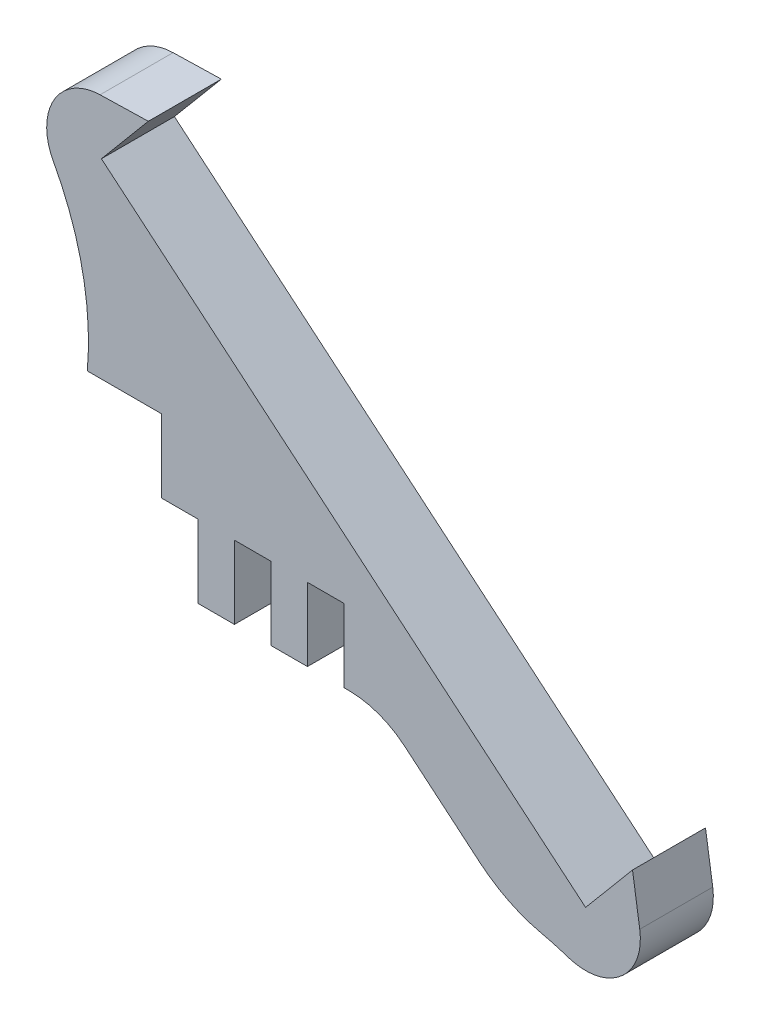
ISO-10303-21;
HEADER;
FILE_DESCRIPTION(('STEP AP214'),'2;1');
FILE_NAME('part.step','',(''),(''),'','','');
FILE_SCHEMA(('AUTOMOTIVE_DESIGN { 1 0 10303 214 1 1 1 1 }'));
ENDSEC;
DATA;
#1=APPLICATION_CONTEXT('core data for automotive mechanical design processes');
#2=APPLICATION_PROTOCOL_DEFINITION('international standard','automotive_design',2000,#1);
#3=PRODUCT_CONTEXT('',#1,'mechanical');
#4=PRODUCT('Part','Part','',(#3));
#5=PRODUCT_RELATED_PRODUCT_CATEGORY('part','',(#4));
#6=PRODUCT_DEFINITION_FORMATION('','',#4);
#7=PRODUCT_DEFINITION_CONTEXT('part definition',#1,'design');
#8=PRODUCT_DEFINITION('design','',#6,#7);
#9=PRODUCT_DEFINITION_SHAPE('','',#8);
#10=(LENGTH_UNIT() NAMED_UNIT(*) SI_UNIT(.MILLI.,.METRE.));
#11=(NAMED_UNIT(*) PLANE_ANGLE_UNIT() SI_UNIT($,.RADIAN.));
#12=(NAMED_UNIT(*) SI_UNIT($,.STERADIAN.) SOLID_ANGLE_UNIT());
#13=UNCERTAINTY_MEASURE_WITH_UNIT(LENGTH_MEASURE(1.E-05),#10,'distance_accuracy_value','');
#14=(GEOMETRIC_REPRESENTATION_CONTEXT(3) GLOBAL_UNCERTAINTY_ASSIGNED_CONTEXT((#13)) GLOBAL_UNIT_ASSIGNED_CONTEXT((#10,
#11,#12)) REPRESENTATION_CONTEXT('',''));
#15=CARTESIAN_POINT('',(0.,0.,0.));
#16=DIRECTION('',(0.,0.,1.));
#17=DIRECTION('',(1.,0.,0.));
#18=AXIS2_PLACEMENT_3D('',#15,#16,#17);
#19=CARTESIAN_POINT('',(11.3170651448543,0.,6.35));
#20=DIRECTION('',(1.,0.,0.));
#21=DIRECTION('',(0.,0.,-1.));
#22=AXIS2_PLACEMENT_3D('',#19,#20,#21);
#23=PLANE('',#22);
#24=DIRECTION('',(0.,-1.,0.));
#25=VECTOR('',#24,1.);
#26=CARTESIAN_POINT('',(11.3170651448543,0.,0.));
#27=LINE('',#26,#25);
#28=CARTESIAN_POINT('',(11.3170651448543,0.,0.));
#29=VERTEX_POINT('',#28);
#30=CARTESIAN_POINT('',(11.3170651448543,-6.35,0.));
#31=VERTEX_POINT('',#30);
#32=EDGE_CURVE('E235',#29,#31,#27,.T.);
#33=ORIENTED_EDGE('',*,*,#32,.T.);
#34=DIRECTION('',(0.,0.,-1.));
#35=VECTOR('',#34,1.);
#36=CARTESIAN_POINT('',(11.3170651448543,-6.35,6.35));
#37=LINE('',#36,#35);
#38=CARTESIAN_POINT('',(11.3170651448543,-6.35,6.35));
#39=VERTEX_POINT('',#38);
#40=EDGE_CURVE('E11',#39,#31,#37,.T.);
#41=ORIENTED_EDGE('',*,*,#40,.F.);
#42=DIRECTION('',(0.,-1.,0.));
#43=VECTOR('',#42,1.);
#44=CARTESIAN_POINT('',(11.3170651448543,0.,6.35));
#45=LINE('',#44,#43);
#46=CARTESIAN_POINT('',(11.3170651448543,0.,6.35));
#47=VERTEX_POINT('',#46);
#48=EDGE_CURVE('E283',#47,#39,#45,.T.);
#49=ORIENTED_EDGE('',*,*,#48,.F.);
#50=DIRECTION('',(0.,0.,-1.));
#51=VECTOR('',#50,1.);
#52=CARTESIAN_POINT('',(11.3170651448543,0.,6.35));
#53=LINE('',#52,#51);
#54=EDGE_CURVE('E231',#47,#29,#53,.T.);
#55=ORIENTED_EDGE('',*,*,#54,.T.);
#56=EDGE_LOOP('',(#33,#41,#49,#55));
#57=FACE_BOUND('',#56,.T.);
#58=ADVANCED_FACE('F37',(#57),#23,.F.);
#59=CARTESIAN_POINT('',(11.3170651448543,-6.35,6.35));
#60=DIRECTION('',(0.,1.,0.));
#61=DIRECTION('',(0.,0.,1.));
#62=AXIS2_PLACEMENT_3D('',#59,#60,#61);
#63=PLANE('',#62);
#64=DIRECTION('',(1.,0.,0.));
#65=VECTOR('',#64,1.);
#66=CARTESIAN_POINT('',(11.3170651448543,-6.35,0.));
#67=LINE('',#66,#65);
#68=CARTESIAN_POINT('',(14.4920651448543,-6.35,0.));
#69=VERTEX_POINT('',#68);
#70=EDGE_CURVE('E238',#31,#69,#67,.T.);
#71=ORIENTED_EDGE('',*,*,#70,.T.);
#72=DIRECTION('',(0.,0.,-1.));
#73=VECTOR('',#72,1.);
#74=CARTESIAN_POINT('',(14.4920651448543,-6.35,6.35));
#75=LINE('',#74,#73);
#76=CARTESIAN_POINT('',(14.4920651448543,-6.35,6.35));
#77=VERTEX_POINT('',#76);
#78=EDGE_CURVE('E45',#77,#69,#75,.T.);
#79=ORIENTED_EDGE('',*,*,#78,.F.);
#80=DIRECTION('',(1.,0.,0.));
#81=VECTOR('',#80,1.);
#82=CARTESIAN_POINT('',(11.3170651448543,-6.35,6.35));
#83=LINE('',#82,#81);
#84=EDGE_CURVE('E147',#39,#77,#83,.T.);
#85=ORIENTED_EDGE('',*,*,#84,.F.);
#86=ORIENTED_EDGE('',*,*,#40,.T.);
#87=EDGE_LOOP('',(#71,#79,#85,#86));
#88=FACE_BOUND('',#87,.T.);
#89=ADVANCED_FACE('F426',(#88),#63,.F.);
#90=CARTESIAN_POINT('',(14.4920651448543,-6.35,6.35));
#91=DIRECTION('',(-1.,0.,0.));
#92=DIRECTION('',(0.,0.,1.));
#93=AXIS2_PLACEMENT_3D('',#90,#91,#92);
#94=PLANE('',#93);
#95=DIRECTION('',(0.,1.,0.));
#96=VECTOR('',#95,1.);
#97=CARTESIAN_POINT('',(14.4920651448543,-6.35,0.));
#98=LINE('',#97,#96);
#99=CARTESIAN_POINT('',(14.4920651448543,0.,0.));
#100=VERTEX_POINT('',#99);
#101=EDGE_CURVE('E240',#69,#100,#98,.T.);
#102=ORIENTED_EDGE('',*,*,#101,.T.);
#103=DIRECTION('',(0.,0.,-1.));
#104=VECTOR('',#103,1.);
#105=CARTESIAN_POINT('',(14.4920651448543,0.,6.35));
#106=LINE('',#105,#104);
#107=CARTESIAN_POINT('',(14.4920651448543,0.,6.35));
#108=VERTEX_POINT('',#107);
#109=EDGE_CURVE('E341',#108,#100,#106,.T.);
#110=ORIENTED_EDGE('',*,*,#109,.F.);
#111=DIRECTION('',(0.,1.,0.));
#112=VECTOR('',#111,1.);
#113=CARTESIAN_POINT('',(14.4920651448543,-6.35,6.35));
#114=LINE('',#113,#112);
#115=EDGE_CURVE('E349',#77,#108,#114,.T.);
#116=ORIENTED_EDGE('',*,*,#115,.F.);
#117=ORIENTED_EDGE('',*,*,#78,.T.);
#118=EDGE_LOOP('',(#102,#110,#116,#117));
#119=FACE_BOUND('',#118,.T.);
#120=ADVANCED_FACE('F347',(#119),#94,.F.);
#121=CARTESIAN_POINT('',(14.4920651448543,0.,6.35));
#122=DIRECTION('',(0.,1.,0.));
#123=DIRECTION('',(0.,0.,1.));
#124=AXIS2_PLACEMENT_3D('',#121,#122,#123);
#125=PLANE('',#124);
#126=DIRECTION('',(1.,0.,0.));
#127=VECTOR('',#126,1.);
#128=CARTESIAN_POINT('',(14.4920651448543,0.,0.));
#129=LINE('',#128,#127);
#130=CARTESIAN_POINT('',(17.6670651448544,0.,0.));
#131=VERTEX_POINT('',#130);
#132=EDGE_CURVE('E242',#100,#131,#129,.T.);
#133=ORIENTED_EDGE('',*,*,#132,.T.);
#134=DIRECTION('',(0.,0.,-1.));
#135=VECTOR('',#134,1.);
#136=CARTESIAN_POINT('',(17.6670651448544,0.,6.35));
#137=LINE('',#136,#135);
#138=CARTESIAN_POINT('',(17.6670651448544,0.,6.35));
#139=VERTEX_POINT('',#138);
#140=EDGE_CURVE('E338',#139,#131,#137,.T.);
#141=ORIENTED_EDGE('',*,*,#140,.F.);
#142=DIRECTION('',(1.,0.,0.));
#143=VECTOR('',#142,1.);
#144=CARTESIAN_POINT('',(14.4920651448543,0.,6.35));
#145=LINE('',#144,#143);
#146=EDGE_CURVE('E367',#108,#139,#145,.T.);
#147=ORIENTED_EDGE('',*,*,#146,.F.);
#148=ORIENTED_EDGE('',*,*,#109,.T.);
#149=EDGE_LOOP('',(#133,#141,#147,#148));
#150=FACE_BOUND('',#149,.T.);
#151=ADVANCED_FACE('F358',(#150),#125,.F.);
#152=CARTESIAN_POINT('',(17.6670651448544,0.,6.35));
#153=DIRECTION('',(1.,0.,0.));
#154=DIRECTION('',(0.,0.,-1.));
#155=AXIS2_PLACEMENT_3D('',#152,#153,#154);
#156=PLANE('',#155);
#157=DIRECTION('',(0.,-1.,0.));
#158=VECTOR('',#157,1.);
#159=CARTESIAN_POINT('',(17.6670651448544,0.,0.));
#160=LINE('',#159,#158);
#161=CARTESIAN_POINT('',(17.6670651448544,-6.35,0.));
#162=VERTEX_POINT('',#161);
#163=EDGE_CURVE('E244',#131,#162,#160,.T.);
#164=ORIENTED_EDGE('',*,*,#163,.T.);
#165=DIRECTION('',(0.,0.,-1.));
#166=VECTOR('',#165,1.);
#167=CARTESIAN_POINT('',(17.6670651448544,-6.35,6.35));
#168=LINE('',#167,#166);
#169=CARTESIAN_POINT('',(17.6670651448544,-6.35,6.35));
#170=VERTEX_POINT('',#169);
#171=EDGE_CURVE('E335',#170,#162,#168,.T.);
#172=ORIENTED_EDGE('',*,*,#171,.F.);
#173=DIRECTION('',(0.,-1.,0.));
#174=VECTOR('',#173,1.);
#175=CARTESIAN_POINT('',(17.6670651448544,0.,6.35));
#176=LINE('',#175,#174);
#177=EDGE_CURVE('E364',#139,#170,#176,.T.);
#178=ORIENTED_EDGE('',*,*,#177,.F.);
#179=ORIENTED_EDGE('',*,*,#140,.T.);
#180=EDGE_LOOP('',(#164,#172,#178,#179));
#181=FACE_BOUND('',#180,.T.);
#182=ADVANCED_FACE('F362',(#181),#156,.F.);
#183=CARTESIAN_POINT('',(17.6670651448544,-6.35,6.35));
#184=DIRECTION('',(0.,1.,0.));
#185=DIRECTION('',(0.,0.,1.));
#186=AXIS2_PLACEMENT_3D('',#183,#184,#185);
#187=PLANE('',#186);
#188=DIRECTION('',(1.,0.,0.));
#189=VECTOR('',#188,1.);
#190=CARTESIAN_POINT('',(17.6670651448544,-6.35,0.));
#191=LINE('',#190,#189);
#192=CARTESIAN_POINT('',(20.8420651448544,-6.35,0.));
#193=VERTEX_POINT('',#192);
#194=EDGE_CURVE('E246',#162,#193,#191,.T.);
#195=ORIENTED_EDGE('',*,*,#194,.T.);
#196=DIRECTION('',(0.,0.,-1.));
#197=VECTOR('',#196,1.);
#198=CARTESIAN_POINT('',(20.8420651448544,-6.35,6.35));
#199=LINE('',#198,#197);
#200=CARTESIAN_POINT('',(20.8420651448544,-6.35,6.35));
#201=VERTEX_POINT('',#200);
#202=EDGE_CURVE('E332',#201,#193,#199,.T.);
#203=ORIENTED_EDGE('',*,*,#202,.F.);
#204=DIRECTION('',(1.,0.,0.));
#205=VECTOR('',#204,1.);
#206=CARTESIAN_POINT('',(17.6670651448544,-6.35,6.35));
#207=LINE('',#206,#205);
#208=EDGE_CURVE('E366',#170,#201,#207,.T.);
#209=ORIENTED_EDGE('',*,*,#208,.F.);
#210=ORIENTED_EDGE('',*,*,#171,.T.);
#211=EDGE_LOOP('',(#195,#203,#209,#210));
#212=FACE_BOUND('',#211,.T.);
#213=ADVANCED_FACE('F439',(#212),#187,.F.);
#214=CARTESIAN_POINT('',(20.8420651448544,-6.35,6.35));
#215=DIRECTION('',(-1.,0.,0.));
#216=DIRECTION('',(0.,0.,1.));
#217=AXIS2_PLACEMENT_3D('',#214,#215,#216);
#218=PLANE('',#217);
#219=DIRECTION('',(0.,1.,0.));
#220=VECTOR('',#219,1.);
#221=CARTESIAN_POINT('',(20.8420651448544,-6.35,0.));
#222=LINE('',#221,#220);
#223=CARTESIAN_POINT('',(20.8420651448544,0.,0.));
#224=VERTEX_POINT('',#223);
#225=EDGE_CURVE('E248',#193,#224,#222,.T.);
#226=ORIENTED_EDGE('',*,*,#225,.T.);
#227=DIRECTION('',(0.,0.,-1.));
#228=VECTOR('',#227,1.);
#229=CARTESIAN_POINT('',(20.8420651448544,0.,6.35));
#230=LINE('',#229,#228);
#231=CARTESIAN_POINT('',(20.8420651448544,0.,6.35));
#232=VERTEX_POINT('',#231);
#233=EDGE_CURVE('E329',#232,#224,#230,.T.);
#234=ORIENTED_EDGE('',*,*,#233,.F.);
#235=DIRECTION('',(0.,1.,0.));
#236=VECTOR('',#235,1.);
#237=CARTESIAN_POINT('',(20.8420651448544,-6.35,6.35));
#238=LINE('',#237,#236);
#239=EDGE_CURVE('E369',#201,#232,#238,.T.);
#240=ORIENTED_EDGE('',*,*,#239,.F.);
#241=ORIENTED_EDGE('',*,*,#202,.T.);
#242=EDGE_LOOP('',(#226,#234,#240,#241));
#243=FACE_BOUND('',#242,.T.);
#244=ADVANCED_FACE('F442',(#243),#218,.F.);
#245=CARTESIAN_POINT('',(20.8420651448544,0.,6.35));
#246=DIRECTION('',(0.,1.,0.));
#247=DIRECTION('',(0.,0.,1.));
#248=AXIS2_PLACEMENT_3D('',#245,#246,#247);
#249=PLANE('',#248);
#250=DIRECTION('',(1.,0.,0.));
#251=VECTOR('',#250,1.);
#252=CARTESIAN_POINT('',(20.8420651448544,0.,0.));
#253=LINE('',#252,#251);
#254=CARTESIAN_POINT('',(24.0170651448543,0.,0.));
#255=VERTEX_POINT('',#254);
#256=EDGE_CURVE('E250',#224,#255,#253,.T.);
#257=ORIENTED_EDGE('',*,*,#256,.T.);
#258=DIRECTION('',(0.,0.,-1.));
#259=VECTOR('',#258,1.);
#260=CARTESIAN_POINT('',(24.0170651448543,0.,6.35));
#261=LINE('',#260,#259);
#262=CARTESIAN_POINT('',(24.0170651448543,0.,6.35));
#263=VERTEX_POINT('',#262);
#264=EDGE_CURVE('E326',#263,#255,#261,.T.);
#265=ORIENTED_EDGE('',*,*,#264,.F.);
#266=DIRECTION('',(1.,0.,0.));
#267=VECTOR('',#266,1.);
#268=CARTESIAN_POINT('',(20.8420651448544,0.,6.35));
#269=LINE('',#268,#267);
#270=EDGE_CURVE('E375',#232,#263,#269,.T.);
#271=ORIENTED_EDGE('',*,*,#270,.F.);
#272=ORIENTED_EDGE('',*,*,#233,.T.);
#273=EDGE_LOOP('',(#257,#265,#271,#272));
#274=FACE_BOUND('',#273,.T.);
#275=ADVANCED_FACE('F446',(#274),#249,.F.);
#276=CARTESIAN_POINT('',(24.0170651448543,0.,6.35));
#277=DIRECTION('',(1.,0.,0.));
#278=DIRECTION('',(0.,1.,0.));
#279=AXIS2_PLACEMENT_3D('',#276,#277,#278);
#280=PLANE('',#279);
#281=DIRECTION('',(0.,-1.,0.));
#282=VECTOR('',#281,1.);
#283=CARTESIAN_POINT('',(24.0170651448543,0.,0.));
#284=LINE('',#283,#282);
#285=CARTESIAN_POINT('',(24.0170651448544,-6.35,0.));
#286=VERTEX_POINT('',#285);
#287=EDGE_CURVE('E252',#255,#286,#284,.T.);
#288=ORIENTED_EDGE('',*,*,#287,.T.);
#289=DIRECTION('',(0.,0.,-1.));
#290=VECTOR('',#289,1.);
#291=CARTESIAN_POINT('',(24.0170651448544,-6.35,6.35));
#292=LINE('',#291,#290);
#293=CARTESIAN_POINT('',(24.0170651448544,-6.35,6.35));
#294=VERTEX_POINT('',#293);
#295=EDGE_CURVE('E323',#294,#286,#292,.T.);
#296=ORIENTED_EDGE('',*,*,#295,.F.);
#297=DIRECTION('',(0.,-1.,0.));
#298=VECTOR('',#297,1.);
#299=CARTESIAN_POINT('',(24.0170651448543,0.,6.35));
#300=LINE('',#299,#298);
#301=EDGE_CURVE('E377',#263,#294,#300,.T.);
#302=ORIENTED_EDGE('',*,*,#301,.F.);
#303=ORIENTED_EDGE('',*,*,#264,.T.);
#304=EDGE_LOOP('',(#288,#296,#302,#303));
#305=FACE_BOUND('',#304,.T.);
#306=ADVANCED_FACE('F450',(#305),#280,.F.);
#307=CARTESIAN_POINT('',(24.0170651448544,-6.35,6.35));
#308=DIRECTION('',(0.,1.,0.));
#309=DIRECTION('',(0.,0.,1.));
#310=AXIS2_PLACEMENT_3D('',#307,#308,#309);
#311=PLANE('',#310);
#312=DIRECTION('',(1.,0.,0.));
#313=VECTOR('',#312,1.);
#314=CARTESIAN_POINT('',(24.0170651448544,-6.35,0.));
#315=LINE('',#314,#313);
#316=CARTESIAN_POINT('',(24.4186119597459,-6.35,0.));
#317=VERTEX_POINT('',#316);
#318=EDGE_CURVE('E254',#286,#317,#315,.T.);
#319=ORIENTED_EDGE('',*,*,#318,.T.);
#320=DIRECTION('',(0.,0.,-1.));
#321=VECTOR('',#320,1.);
#322=CARTESIAN_POINT('',(24.4186119597459,-6.35,6.35));
#323=LINE('',#322,#321);
#324=CARTESIAN_POINT('',(24.4186119597459,-6.35,6.35));
#325=VERTEX_POINT('',#324);
#326=EDGE_CURVE('E320',#325,#317,#323,.T.);
#327=ORIENTED_EDGE('',*,*,#326,.F.);
#328=DIRECTION('',(1.,0.,0.));
#329=VECTOR('',#328,1.);
#330=CARTESIAN_POINT('',(24.0170651448544,-6.35,6.35));
#331=LINE('',#330,#329);
#332=EDGE_CURVE('E379',#294,#325,#331,.T.);
#333=ORIENTED_EDGE('',*,*,#332,.F.);
#334=ORIENTED_EDGE('',*,*,#295,.T.);
#335=EDGE_LOOP('',(#319,#327,#333,#334));
#336=FACE_BOUND('',#335,.T.);
#337=ADVANCED_FACE('F454',(#336),#311,.F.);
#338=CARTESIAN_POINT('',(24.4186119597459,-13.97,6.35));
#339=DIRECTION('',(0.,0.,-1.));
#340=DIRECTION('',(-1.,0.,0.));
#341=AXIS2_PLACEMENT_3D('',#338,#339,#340);
#342=CYLINDRICAL_SURFACE('',#341,7.62);
#343=CARTESIAN_POINT('',(24.4186119597459,-13.97,0.));
#344=DIRECTION('',(0.,0.,-1.));
#345=DIRECTION('',(-1.,0.,0.));
#346=AXIS2_PLACEMENT_3D('',#343,#344,#345);
#347=CIRCLE('',#346,7.62);
#348=CARTESIAN_POINT('',(29.3166535455573,-8.13274134343337,0.));
#349=VERTEX_POINT('',#348);
#350=EDGE_CURVE('E256',#317,#349,#347,.T.);
#351=ORIENTED_EDGE('',*,*,#350,.T.);
#352=DIRECTION('',(0.,0.,-1.));
#353=VECTOR('',#352,1.);
#354=CARTESIAN_POINT('',(29.3166535455573,-8.13274134343337,6.35));
#355=LINE('',#354,#353);
#356=CARTESIAN_POINT('',(29.3166535455573,-8.13274134343337,6.35));
#357=VERTEX_POINT('',#356);
#358=EDGE_CURVE('E317',#357,#349,#355,.T.);
#359=ORIENTED_EDGE('',*,*,#358,.F.);
#360=CARTESIAN_POINT('',(24.4186119597459,-13.97,6.35));
#361=DIRECTION('',(0.,0.,-1.));
#362=DIRECTION('',(-1.,0.,0.));
#363=AXIS2_PLACEMENT_3D('',#360,#361,#362);
#364=CIRCLE('',#363,7.62);
#365=EDGE_CURVE('E381',#325,#357,#364,.T.);
#366=ORIENTED_EDGE('',*,*,#365,.F.);
#367=ORIENTED_EDGE('',*,*,#326,.T.);
#368=EDGE_LOOP('',(#351,#359,#366,#367));
#369=FACE_BOUND('',#368,.T.);
#370=ADVANCED_FACE('F458',(#369),#342,.F.);
#371=CARTESIAN_POINT('',(29.3166535455573,-8.13274134343337,6.35));
#372=DIRECTION('',(0.642787609686534,0.766044443118982,0.));
#373=DIRECTION('',(-0.766044443118982,0.642787609686535,0.));
#374=AXIS2_PLACEMENT_3D('',#371,#372,#373);
#375=PLANE('',#374);
#376=DIRECTION('',(0.766044443118982,-0.642787609686534,0.));
#377=VECTOR('',#376,1.);
#378=CARTESIAN_POINT('',(29.3166535455573,-8.13274134343337,0.));
#379=LINE('',#378,#377);
#380=CARTESIAN_POINT('',(35.8298243731926,-13.5979405826967,0.));
#381=VERTEX_POINT('',#380);
#382=EDGE_CURVE('E258',#349,#381,#379,.T.);
#383=ORIENTED_EDGE('',*,*,#382,.T.);
#384=DIRECTION('',(0.,0.,-1.));
#385=VECTOR('',#384,1.);
#386=CARTESIAN_POINT('',(35.8298243731926,-13.5979405826967,6.35));
#387=LINE('',#386,#385);
#388=CARTESIAN_POINT('',(35.8298243731926,-13.5979405826967,6.35));
#389=VERTEX_POINT('',#388);
#390=EDGE_CURVE('E314',#389,#381,#387,.T.);
#391=ORIENTED_EDGE('',*,*,#390,.F.);
#392=DIRECTION('',(0.766044443118982,-0.642787609686534,0.));
#393=VECTOR('',#392,1.);
#394=CARTESIAN_POINT('',(29.3166535455573,-8.13274134343337,6.35));
#395=LINE('',#394,#393);
#396=EDGE_CURVE('E383',#357,#389,#395,.T.);
#397=ORIENTED_EDGE('',*,*,#396,.F.);
#398=ORIENTED_EDGE('',*,*,#358,.T.);
#399=EDGE_LOOP('',(#383,#391,#397,#398));
#400=FACE_BOUND('',#399,.T.);
#401=ADVANCED_FACE('F462',(#400),#375,.F.);
#402=CARTESIAN_POINT('',(43.9932270162116,-3.86917615508561,6.35));
#403=DIRECTION('',(0.,0.,-1.));
#404=DIRECTION('',(-1.,0.,0.));
#405=AXIS2_PLACEMENT_3D('',#402,#403,#404);
#406=CYLINDRICAL_SURFACE('',#405,12.7);
#407=CARTESIAN_POINT('',(43.9932270162116,-3.86917615508561,0.));
#408=DIRECTION('',(0.,0.,1.));
#409=DIRECTION('',(-1.,0.,0.));
#410=AXIS2_PLACEMENT_3D('',#407,#408,#409);
#411=CIRCLE('',#410,12.7);
#412=CARTESIAN_POINT('',(41.1660772456548,-16.2505017777659,0.));
#413=VERTEX_POINT('',#412);
#414=EDGE_CURVE('E260',#381,#413,#411,.T.);
#415=ORIENTED_EDGE('',*,*,#414,.T.);
#416=DIRECTION('',(0.,0.,-1.));
#417=VECTOR('',#416,1.);
#418=CARTESIAN_POINT('',(41.1660772456548,-16.2505017777659,6.35));
#419=LINE('',#418,#417);
#420=CARTESIAN_POINT('',(41.1660772456548,-16.2505017777659,6.35));
#421=VERTEX_POINT('',#420);
#422=EDGE_CURVE('E311',#421,#413,#419,.T.);
#423=ORIENTED_EDGE('',*,*,#422,.F.);
#424=CARTESIAN_POINT('',(43.9932270162116,-3.86917615508561,6.35));
#425=DIRECTION('',(0.,0.,1.));
#426=DIRECTION('',(-1.,0.,0.));
#427=AXIS2_PLACEMENT_3D('',#424,#425,#426);
#428=CIRCLE('',#427,12.7);
#429=EDGE_CURVE('E385',#389,#421,#428,.T.);
#430=ORIENTED_EDGE('',*,*,#429,.F.);
#431=ORIENTED_EDGE('',*,*,#390,.T.);
#432=EDGE_LOOP('',(#415,#423,#430,#431));
#433=FACE_BOUND('',#432,.T.);
#434=ADVANCED_FACE('F466',(#433),#406,.T.);
#435=CARTESIAN_POINT('',(35.5117777045411,-41.0131530231266,6.35));
#436=DIRECTION('',(0.,0.,-1.));
#437=DIRECTION('',(-1.,0.,0.));
#438=AXIS2_PLACEMENT_3D('',#435,#436,#437);
#439=CYLINDRICAL_SURFACE('',#438,25.4);
#440=CARTESIAN_POINT('',(35.5117777045411,-41.0131530231266,0.));
#441=DIRECTION('',(0.,0.,-1.));
#442=DIRECTION('',(1.,0.,0.));
#443=AXIS2_PLACEMENT_3D('',#440,#441,#442);
#444=CIRCLE('',#443,25.4);
#445=CARTESIAN_POINT('',(43.5390632584764,-16.9149645718014,0.));
#446=VERTEX_POINT('',#445);
#447=EDGE_CURVE('E262',#413,#446,#444,.T.);
#448=ORIENTED_EDGE('',*,*,#447,.T.);
#449=DIRECTION('',(0.,0.,-1.));
#450=VECTOR('',#449,1.);
#451=CARTESIAN_POINT('',(43.5390632584764,-16.9149645718014,6.35));
#452=LINE('',#451,#450);
#453=CARTESIAN_POINT('',(43.5390632584764,-16.9149645718014,6.35));
#454=VERTEX_POINT('',#453);
#455=EDGE_CURVE('E308',#454,#446,#452,.T.);
#456=ORIENTED_EDGE('',*,*,#455,.F.);
#457=CARTESIAN_POINT('',(35.5117777045411,-41.0131530231266,6.35));
#458=DIRECTION('',(0.,0.,-1.));
#459=DIRECTION('',(1.,0.,0.));
#460=AXIS2_PLACEMENT_3D('',#457,#458,#459);
#461=CIRCLE('',#460,25.4);
#462=EDGE_CURVE('E387',#421,#454,#461,.T.);
#463=ORIENTED_EDGE('',*,*,#462,.F.);
#464=ORIENTED_EDGE('',*,*,#422,.T.);
#465=EDGE_LOOP('',(#448,#456,#463,#464));
#466=FACE_BOUND('',#465,.T.);
#467=ADVANCED_FACE('F470',(#466),#439,.F.);
#468=CARTESIAN_POINT('',(45.0441792998393,-12.3965542371779,6.35));
#469=DIRECTION('',(0.,0.,-1.));
#470=DIRECTION('',(-1.,0.,0.));
#471=AXIS2_PLACEMENT_3D('',#468,#469,#470);
#472=CYLINDRICAL_SURFACE('',#471,4.7625);
#473=CARTESIAN_POINT('',(45.0441792998393,-12.3965542371779,0.));
#474=DIRECTION('',(0.,0.,1.));
#475=DIRECTION('',(-1.,0.,0.));
#476=AXIS2_PLACEMENT_3D('',#473,#474,#475);
#477=CIRCLE('',#476,4.7625);
#478=CARTESIAN_POINT('',(49.7532510968812,-11.6851829836794,0.));
#479=VERTEX_POINT('',#478);
#480=EDGE_CURVE('E264',#446,#479,#477,.T.);
#481=ORIENTED_EDGE('',*,*,#480,.T.);
#482=DIRECTION('',(0.,0.,-1.));
#483=VECTOR('',#482,1.);
#484=CARTESIAN_POINT('',(49.7532510968812,-11.6851829836794,6.35));
#485=LINE('',#484,#483);
#486=CARTESIAN_POINT('',(49.7532510968812,-11.6851829836794,6.35));
#487=VERTEX_POINT('',#486);
#488=EDGE_CURVE('E305',#487,#479,#485,.T.);
#489=ORIENTED_EDGE('',*,*,#488,.F.);
#490=CARTESIAN_POINT('',(45.0441792998393,-12.3965542371779,6.35));
#491=DIRECTION('',(0.,0.,1.));
#492=DIRECTION('',(-1.,0.,0.));
#493=AXIS2_PLACEMENT_3D('',#490,#491,#492);
#494=CIRCLE('',#493,4.7625);
#495=EDGE_CURVE('E389',#454,#487,#494,.T.);
#496=ORIENTED_EDGE('',*,*,#495,.F.);
#497=ORIENTED_EDGE('',*,*,#455,.T.);
#498=EDGE_LOOP('',(#481,#489,#496,#497));
#499=FACE_BOUND('',#498,.T.);
#500=ADVANCED_FACE('F474',(#499),#472,.T.);
#501=CARTESIAN_POINT('',(49.1258806213487,-7.53217202337241,6.35));
#502=DIRECTION('',(-0.988781479693848,-0.149369292073183,0.));
#503=DIRECTION('',(0.149369292073183,-0.988781479693848,0.));
#504=AXIS2_PLACEMENT_3D('',#501,#502,#503);
#505=PLANE('',#504);
#506=DIRECTION('',(-0.149369292073183,0.988781479693848,0.));
#507=VECTOR('',#506,1.);
#508=CARTESIAN_POINT('',(49.1258806213487,-7.53217202337241,0.));
#509=LINE('',#508,#507);
#510=CARTESIAN_POINT('',(49.1258806213487,-7.53217202337241,0.));
#511=VERTEX_POINT('',#510);
#512=EDGE_CURVE('E266',#479,#511,#509,.T.);
#513=ORIENTED_EDGE('',*,*,#512,.T.);
#514=DIRECTION('',(0.,0.,-1.));
#515=VECTOR('',#514,1.);
#516=CARTESIAN_POINT('',(49.1258806213487,-7.53217202337241,6.35));
#517=LINE('',#516,#515);
#518=CARTESIAN_POINT('',(49.1258806213487,-7.53217202337241,6.35));
#519=VERTEX_POINT('',#518);
#520=EDGE_CURVE('E302',#519,#511,#517,.T.);
#521=ORIENTED_EDGE('',*,*,#520,.F.);
#522=DIRECTION('',(-0.149369292073183,0.988781479693848,0.));
#523=VECTOR('',#522,1.);
#524=CARTESIAN_POINT('',(49.1258806213487,-7.53217202337241,6.35));
#525=LINE('',#524,#523);
#526=EDGE_CURVE('E391',#487,#519,#525,.T.);
#527=ORIENTED_EDGE('',*,*,#526,.F.);
#528=ORIENTED_EDGE('',*,*,#488,.T.);
#529=EDGE_LOOP('',(#513,#521,#527,#528));
#530=FACE_BOUND('',#529,.T.);
#531=ADVANCED_FACE('F478',(#530),#505,.F.);
#532=CARTESIAN_POINT('',(45.0441792998393,-12.3965542371779,6.35));
#533=DIRECTION('',(0.766044443118983,-0.642787609686533,0.));
#534=DIRECTION('',(0.642787609686533,0.766044443118983,0.));
#535=AXIS2_PLACEMENT_3D('',#532,#533,#534);
#536=PLANE('',#535);
#537=DIRECTION('',(-0.642787609686533,-0.766044443118983,0.));
#538=VECTOR('',#537,1.);
#539=CARTESIAN_POINT('',(45.0441792998393,-12.3965542371779,0.));
#540=LINE('',#539,#538);
#541=CARTESIAN_POINT('',(45.0441792998393,-12.3965542371779,0.));
#542=VERTEX_POINT('',#541);
#543=EDGE_CURVE('E268',#511,#542,#540,.T.);
#544=ORIENTED_EDGE('',*,*,#543,.T.);
#545=DIRECTION('',(0.,0.,-1.));
#546=VECTOR('',#545,1.);
#547=CARTESIAN_POINT('',(45.0441792998393,-12.3965542371779,6.35));
#548=LINE('',#547,#546);
#549=CARTESIAN_POINT('',(45.0441792998393,-12.3965542371779,6.35));
#550=VERTEX_POINT('',#549);
#551=EDGE_CURVE('E299',#550,#542,#548,.T.);
#552=ORIENTED_EDGE('',*,*,#551,.F.);
#553=DIRECTION('',(-0.642787609686533,-0.766044443118983,0.));
#554=VECTOR('',#553,1.);
#555=CARTESIAN_POINT('',(45.0441792998393,-12.3965542371779,6.35));
#556=LINE('',#555,#554);
#557=EDGE_CURVE('E393',#519,#550,#556,.T.);
#558=ORIENTED_EDGE('',*,*,#557,.F.);
#559=ORIENTED_EDGE('',*,*,#520,.T.);
#560=EDGE_LOOP('',(#544,#552,#558,#559));
#561=FACE_BOUND('',#560,.T.);
#562=ADVANCED_FACE('F482',(#561),#536,.F.);
#563=CARTESIAN_POINT('',(45.0441792998393,-12.3965542371779,6.35));
#564=DIRECTION('',(-0.642787609686535,-0.766044443118982,0.));
#565=DIRECTION('',(0.766044443118982,-0.642787609686535,0.));
#566=AXIS2_PLACEMENT_3D('',#563,#564,#565);
#567=PLANE('',#566);
#568=DIRECTION('',(-0.766044443118982,0.642787609686535,0.));
#569=VECTOR('',#568,1.);
#570=CARTESIAN_POINT('',(45.0441792998393,-12.3965542371779,0.));
#571=LINE('',#570,#569);
#572=CARTESIAN_POINT('',(2.91862932828332,22.9509792070943,0.));
#573=VERTEX_POINT('',#572);
#574=EDGE_CURVE('E270',#542,#573,#571,.T.);
#575=ORIENTED_EDGE('',*,*,#574,.T.);
#576=DIRECTION('',(0.,0.,-1.));
#577=VECTOR('',#576,1.);
#578=CARTESIAN_POINT('',(2.91862932828332,22.9509792070943,6.35));
#579=LINE('',#578,#577);
#580=CARTESIAN_POINT('',(2.91862932828332,22.9509792070943,6.35));
#581=VERTEX_POINT('',#580);
#582=EDGE_CURVE('E296',#581,#573,#579,.T.);
#583=ORIENTED_EDGE('',*,*,#582,.F.);
#584=DIRECTION('',(-0.766044443118982,0.642787609686535,0.));
#585=VECTOR('',#584,1.);
#586=CARTESIAN_POINT('',(45.0441792998393,-12.3965542371779,6.35));
#587=LINE('',#586,#585);
#588=EDGE_CURVE('E395',#550,#581,#587,.T.);
#589=ORIENTED_EDGE('',*,*,#588,.F.);
#590=ORIENTED_EDGE('',*,*,#551,.T.);
#591=EDGE_LOOP('',(#575,#583,#589,#590));
#592=FACE_BOUND('',#591,.T.);
#593=ADVANCED_FACE('F486',(#592),#567,.F.);
#594=CARTESIAN_POINT('',(2.91862932828332,22.9509792070943,6.35));
#595=DIRECTION('',(-0.766044443118982,0.642787609686535,0.));
#596=DIRECTION('',(-0.642787609686535,-0.766044443118982,0.));
#597=AXIS2_PLACEMENT_3D('',#594,#595,#596);
#598=PLANE('',#597);
#599=DIRECTION('',(0.642787609686535,0.766044443118982,0.));
#600=VECTOR('',#599,1.);
#601=CARTESIAN_POINT('',(2.91862932828332,22.9509792070943,0.));
#602=LINE('',#601,#600);
#603=CARTESIAN_POINT('',(7.00033064979282,27.8153614208998,0.));
#604=VERTEX_POINT('',#603);
#605=EDGE_CURVE('E272',#573,#604,#602,.T.);
#606=ORIENTED_EDGE('',*,*,#605,.T.);
#607=DIRECTION('',(0.,0.,-1.));
#608=VECTOR('',#607,1.);
#609=CARTESIAN_POINT('',(7.00033064979282,27.8153614208998,6.35));
#610=LINE('',#609,#608);
#611=CARTESIAN_POINT('',(7.00033064979282,27.8153614208998,6.35));
#612=VERTEX_POINT('',#611);
#613=EDGE_CURVE('E293',#612,#604,#610,.T.);
#614=ORIENTED_EDGE('',*,*,#613,.F.);
#615=DIRECTION('',(0.642787609686535,0.766044443118982,0.));
#616=VECTOR('',#615,1.);
#617=CARTESIAN_POINT('',(2.91862932828332,22.9509792070943,6.35));
#618=LINE('',#617,#616);
#619=EDGE_CURVE('E397',#581,#612,#618,.T.);
#620=ORIENTED_EDGE('',*,*,#619,.F.);
#621=ORIENTED_EDGE('',*,*,#582,.T.);
#622=EDGE_LOOP('',(#606,#614,#620,#621));
#623=FACE_BOUND('',#622,.T.);
#624=ADVANCED_FACE('F490',(#623),#598,.F.);
#625=CARTESIAN_POINT('',(7.00033064979282,27.8153614208998,6.35));
#626=DIRECTION('',(0.0246000651640445,-0.999697372605292,0.));
#627=DIRECTION('',(0.999697372605292,0.0246000651640445,0.));
#628=AXIS2_PLACEMENT_3D('',#625,#626,#627);
#629=PLANE('',#628);
#630=DIRECTION('',(-0.999697372605292,-0.0246000651640445,0.));
#631=VECTOR('',#630,1.);
#632=CARTESIAN_POINT('',(7.00033064979282,27.8153614208998,0.));
#633=LINE('',#632,#631);
#634=CARTESIAN_POINT('',(2.80147151793956,27.712037944127,0.));
#635=VERTEX_POINT('',#634);
#636=EDGE_CURVE('E274',#604,#635,#633,.T.);
#637=ORIENTED_EDGE('',*,*,#636,.T.);
#638=DIRECTION('',(0.,0.,-1.));
#639=VECTOR('',#638,1.);
#640=CARTESIAN_POINT('',(2.80147151793956,27.712037944127,6.35));
#641=LINE('',#640,#639);
#642=CARTESIAN_POINT('',(2.80147151793956,27.712037944127,6.35));
#643=VERTEX_POINT('',#642);
#644=EDGE_CURVE('E290',#643,#635,#641,.T.);
#645=ORIENTED_EDGE('',*,*,#644,.F.);
#646=DIRECTION('',(-0.999697372605292,-0.0246000651640445,0.));
#647=VECTOR('',#646,1.);
#648=CARTESIAN_POINT('',(7.00033064979282,27.8153614208998,6.35));
#649=LINE('',#648,#647);
#650=EDGE_CURVE('E399',#612,#643,#649,.T.);
#651=ORIENTED_EDGE('',*,*,#650,.F.);
#652=ORIENTED_EDGE('',*,*,#613,.T.);
#653=EDGE_LOOP('',(#637,#645,#651,#652));
#654=FACE_BOUND('',#653,.T.);
#655=ADVANCED_FACE('F494',(#654),#629,.F.);
#656=CARTESIAN_POINT('',(2.91862932828332,22.9509792070943,6.35));
#657=DIRECTION('',(0.,0.,-1.));
#658=DIRECTION('',(-1.,0.,0.));
#659=AXIS2_PLACEMENT_3D('',#656,#657,#658);
#660=CYLINDRICAL_SURFACE('',#659,4.7625);
#661=CARTESIAN_POINT('',(2.91862932828332,22.9509792070943,0.));
#662=DIRECTION('',(0.,0.,1.));
#663=DIRECTION('',(1.,0.,0.));
#664=AXIS2_PLACEMENT_3D('',#661,#662,#663);
#665=CIRCLE('',#664,4.7625);
#666=CARTESIAN_POINT('',(-1.26977554278441,20.6841155398183,0.));
#667=VERTEX_POINT('',#666);
#668=EDGE_CURVE('E276',#635,#667,#665,.T.);
#669=ORIENTED_EDGE('',*,*,#668,.T.);
#670=DIRECTION('',(0.,0.,-1.));
#671=VECTOR('',#670,1.);
#672=CARTESIAN_POINT('',(-1.26977554278441,20.6841155398183,6.35));
#673=LINE('',#672,#671);
#674=CARTESIAN_POINT('',(-1.26977554278441,20.6841155398183,6.35));
#675=VERTEX_POINT('',#674);
#676=EDGE_CURVE('E287',#675,#667,#673,.T.);
#677=ORIENTED_EDGE('',*,*,#676,.F.);
#678=CARTESIAN_POINT('',(2.91862932828332,22.9509792070943,6.35));
#679=DIRECTION('',(0.,0.,1.));
#680=DIRECTION('',(1.,0.,0.));
#681=AXIS2_PLACEMENT_3D('',#678,#679,#680);
#682=CIRCLE('',#681,4.7625);
#683=EDGE_CURVE('E401',#643,#675,#682,.T.);
#684=ORIENTED_EDGE('',*,*,#683,.F.);
#685=ORIENTED_EDGE('',*,*,#644,.T.);
#686=EDGE_LOOP('',(#669,#677,#684,#685));
#687=FACE_BOUND('',#686,.T.);
#688=ADVANCED_FACE('F407',(#687),#660,.T.);
#689=CARTESIAN_POINT('',(-23.6079348551457,8.59417598101283,6.35));
#690=DIRECTION('',(0.,0.,-1.));
#691=DIRECTION('',(-1.,0.,0.));
#692=AXIS2_PLACEMENT_3D('',#689,#690,#691);
#693=CYLINDRICAL_SURFACE('',#692,25.4);
#694=CARTESIAN_POINT('',(-23.6079348551457,8.59417598101283,0.));
#695=DIRECTION('',(0.,0.,-1.));
#696=DIRECTION('',(-1.,0.,0.));
#697=AXIS2_PLACEMENT_3D('',#694,#695,#696);
#698=CIRCLE('',#697,25.4);
#699=CARTESIAN_POINT('',(1.6927306334585,6.35,0.));
#700=VERTEX_POINT('',#699);
#701=EDGE_CURVE('E278',#667,#700,#698,.T.);
#702=ORIENTED_EDGE('',*,*,#701,.T.);
#703=DIRECTION('',(0.,0.,-1.));
#704=VECTOR('',#703,1.);
#705=CARTESIAN_POINT('',(1.6927306334585,6.35,6.35));
#706=LINE('',#705,#704);
#707=CARTESIAN_POINT('',(1.6927306334585,6.35,6.35));
#708=VERTEX_POINT('',#707);
#709=EDGE_CURVE('E226',#708,#700,#706,.T.);
#710=ORIENTED_EDGE('',*,*,#709,.F.);
#711=CARTESIAN_POINT('',(-23.6079348551457,8.59417598101283,6.35));
#712=DIRECTION('',(0.,0.,-1.));
#713=DIRECTION('',(-1.,0.,0.));
#714=AXIS2_PLACEMENT_3D('',#711,#712,#713);
#715=CIRCLE('',#714,25.4);
#716=EDGE_CURVE('E217',#675,#708,#715,.T.);
#717=ORIENTED_EDGE('',*,*,#716,.F.);
#718=ORIENTED_EDGE('',*,*,#676,.T.);
#719=EDGE_LOOP('',(#702,#710,#717,#718));
#720=FACE_BOUND('',#719,.T.);
#721=ADVANCED_FACE('F411',(#720),#693,.F.);
#722=CARTESIAN_POINT('',(1.6927306334585,6.35,6.35));
#723=DIRECTION('',(0.,1.,0.));
#724=DIRECTION('',(0.,0.,1.));
#725=AXIS2_PLACEMENT_3D('',#722,#723,#724);
#726=PLANE('',#725);
#727=DIRECTION('',(1.,0.,0.));
#728=VECTOR('',#727,1.);
#729=CARTESIAN_POINT('',(1.6927306334585,6.35,0.));
#730=LINE('',#729,#728);
#731=CARTESIAN_POINT('',(8.14206514485435,6.35,0.));
#732=VERTEX_POINT('',#731);
#733=EDGE_CURVE('E225',#700,#732,#730,.T.);
#734=ORIENTED_EDGE('',*,*,#733,.T.);
#735=DIRECTION('',(0.,0.,-1.));
#736=VECTOR('',#735,1.);
#737=CARTESIAN_POINT('',(8.14206514485435,6.35,6.35));
#738=LINE('',#737,#736);
#739=CARTESIAN_POINT('',(8.14206514485435,6.35,6.35));
#740=VERTEX_POINT('',#739);
#741=EDGE_CURVE('E222',#740,#732,#738,.T.);
#742=ORIENTED_EDGE('',*,*,#741,.F.);
#743=DIRECTION('',(1.,0.,0.));
#744=VECTOR('',#743,1.);
#745=CARTESIAN_POINT('',(1.6927306334585,6.35,6.35));
#746=LINE('',#745,#744);
#747=EDGE_CURVE('E211',#708,#740,#746,.T.);
#748=ORIENTED_EDGE('',*,*,#747,.F.);
#749=ORIENTED_EDGE('',*,*,#709,.T.);
#750=EDGE_LOOP('',(#734,#742,#748,#749));
#751=FACE_BOUND('',#750,.T.);
#752=ADVANCED_FACE('F223',(#751),#726,.F.);
#753=CARTESIAN_POINT('',(8.14206514485435,6.35,6.35));
#754=DIRECTION('',(1.,0.,0.));
#755=DIRECTION('',(0.,0.,-1.));
#756=AXIS2_PLACEMENT_3D('',#753,#754,#755);
#757=PLANE('',#756);
#758=DIRECTION('',(0.,-1.,0.));
#759=VECTOR('',#758,1.);
#760=CARTESIAN_POINT('',(8.14206514485435,6.35,0.));
#761=LINE('',#760,#759);
#762=CARTESIAN_POINT('',(8.14206514485435,0.,0.));
#763=VERTEX_POINT('',#762);
#764=EDGE_CURVE('E133',#732,#763,#761,.T.);
#765=ORIENTED_EDGE('',*,*,#764,.T.);
#766=DIRECTION('',(0.,0.,-1.));
#767=VECTOR('',#766,1.);
#768=CARTESIAN_POINT('',(8.14206514485435,0.,6.35));
#769=LINE('',#768,#767);
#770=CARTESIAN_POINT('',(8.14206514485435,0.,6.35));
#771=VERTEX_POINT('',#770);
#772=EDGE_CURVE('E227',#771,#763,#769,.T.);
#773=ORIENTED_EDGE('',*,*,#772,.F.);
#774=DIRECTION('',(0.,-1.,0.));
#775=VECTOR('',#774,1.);
#776=CARTESIAN_POINT('',(8.14206514485435,6.35,6.35));
#777=LINE('',#776,#775);
#778=EDGE_CURVE('E215',#740,#771,#777,.T.);
#779=ORIENTED_EDGE('',*,*,#778,.F.);
#780=ORIENTED_EDGE('',*,*,#741,.T.);
#781=EDGE_LOOP('',(#765,#773,#779,#780));
#782=FACE_BOUND('',#781,.T.);
#783=ADVANCED_FACE('F229',(#782),#757,.F.);
#784=CARTESIAN_POINT('',(8.14206514485435,0.,6.35));
#785=DIRECTION('',(0.,1.,0.));
#786=DIRECTION('',(0.,0.,1.));
#787=AXIS2_PLACEMENT_3D('',#784,#785,#786);
#788=PLANE('',#787);
#789=DIRECTION('',(1.,0.,0.));
#790=VECTOR('',#789,1.);
#791=CARTESIAN_POINT('',(8.14206514485435,0.,0.));
#792=LINE('',#791,#790);
#793=EDGE_CURVE('E139',#763,#29,#792,.T.);
#794=ORIENTED_EDGE('',*,*,#793,.T.);
#795=ORIENTED_EDGE('',*,*,#54,.F.);
#796=DIRECTION('',(1.,0.,0.));
#797=VECTOR('',#796,1.);
#798=CARTESIAN_POINT('',(8.14206514485435,0.,6.35));
#799=LINE('',#798,#797);
#800=EDGE_CURVE('E53',#771,#47,#799,.T.);
#801=ORIENTED_EDGE('',*,*,#800,.F.);
#802=ORIENTED_EDGE('',*,*,#772,.T.);
#803=EDGE_LOOP('',(#794,#795,#801,#802));
#804=FACE_BOUND('',#803,.T.);
#805=ADVANCED_FACE('F415',(#804),#788,.F.);
#806=CARTESIAN_POINT('',(24.4186119597459,-13.97,6.35));
#807=DIRECTION('',(0.,0.,-1.));
#808=DIRECTION('',(-1.,0.,0.));
#809=AXIS2_PLACEMENT_3D('',#806,#807,#808);
#810=PLANE('',#809);
#811=ORIENTED_EDGE('',*,*,#48,.T.);
#812=ORIENTED_EDGE('',*,*,#84,.T.);
#813=ORIENTED_EDGE('',*,*,#115,.T.);
#814=ORIENTED_EDGE('',*,*,#146,.T.);
#815=ORIENTED_EDGE('',*,*,#177,.T.);
#816=ORIENTED_EDGE('',*,*,#208,.T.);
#817=ORIENTED_EDGE('',*,*,#239,.T.);
#818=ORIENTED_EDGE('',*,*,#270,.T.);
#819=ORIENTED_EDGE('',*,*,#301,.T.);
#820=ORIENTED_EDGE('',*,*,#332,.T.);
#821=ORIENTED_EDGE('',*,*,#365,.T.);
#822=ORIENTED_EDGE('',*,*,#396,.T.);
#823=ORIENTED_EDGE('',*,*,#429,.T.);
#824=ORIENTED_EDGE('',*,*,#462,.T.);
#825=ORIENTED_EDGE('',*,*,#495,.T.);
#826=ORIENTED_EDGE('',*,*,#526,.T.);
#827=ORIENTED_EDGE('',*,*,#557,.T.);
#828=ORIENTED_EDGE('',*,*,#588,.T.);
#829=ORIENTED_EDGE('',*,*,#619,.T.);
#830=ORIENTED_EDGE('',*,*,#650,.T.);
#831=ORIENTED_EDGE('',*,*,#683,.T.);
#832=ORIENTED_EDGE('',*,*,#716,.T.);
#833=ORIENTED_EDGE('',*,*,#747,.T.);
#834=ORIENTED_EDGE('',*,*,#778,.T.);
#835=ORIENTED_EDGE('',*,*,#800,.T.);
#836=EDGE_LOOP('',(#811,#812,#813,#814,#815,#816,#817,#818,#819,#820,#821,#822,#823,#824,#825,
#826,#827,#828,#829,#830,#831,#832,#833,#834,#835));
#837=FACE_BOUND('',#836,.T.);
#838=ADVANCED_FACE('F213',(#837),#810,.F.);
#839=CARTESIAN_POINT('',(24.4186119597459,-13.97,0.));
#840=DIRECTION('',(0.,0.,-1.));
#841=DIRECTION('',(-1.,0.,0.));
#842=AXIS2_PLACEMENT_3D('',#839,#840,#841);
#843=PLANE('',#842);
#844=ORIENTED_EDGE('',*,*,#32,.F.);
#845=ORIENTED_EDGE('',*,*,#793,.F.);
#846=ORIENTED_EDGE('',*,*,#764,.F.);
#847=ORIENTED_EDGE('',*,*,#733,.F.);
#848=ORIENTED_EDGE('',*,*,#701,.F.);
#849=ORIENTED_EDGE('',*,*,#668,.F.);
#850=ORIENTED_EDGE('',*,*,#636,.F.);
#851=ORIENTED_EDGE('',*,*,#605,.F.);
#852=ORIENTED_EDGE('',*,*,#574,.F.);
#853=ORIENTED_EDGE('',*,*,#543,.F.);
#854=ORIENTED_EDGE('',*,*,#512,.F.);
#855=ORIENTED_EDGE('',*,*,#480,.F.);
#856=ORIENTED_EDGE('',*,*,#447,.F.);
#857=ORIENTED_EDGE('',*,*,#414,.F.);
#858=ORIENTED_EDGE('',*,*,#382,.F.);
#859=ORIENTED_EDGE('',*,*,#350,.F.);
#860=ORIENTED_EDGE('',*,*,#318,.F.);
#861=ORIENTED_EDGE('',*,*,#287,.F.);
#862=ORIENTED_EDGE('',*,*,#256,.F.);
#863=ORIENTED_EDGE('',*,*,#225,.F.);
#864=ORIENTED_EDGE('',*,*,#194,.F.);
#865=ORIENTED_EDGE('',*,*,#163,.F.);
#866=ORIENTED_EDGE('',*,*,#132,.F.);
#867=ORIENTED_EDGE('',*,*,#101,.F.);
#868=ORIENTED_EDGE('',*,*,#70,.F.);
#869=EDGE_LOOP('',(#844,#845,#846,#847,#848,#849,#850,#851,#852,#853,#854,#855,#856,#857,#858,
#859,#860,#861,#862,#863,#864,#865,#866,#867,#868));
#870=FACE_BOUND('',#869,.T.);
#871=ADVANCED_FACE('F353',(#870),#843,.T.);
#872=CLOSED_SHELL('',(#58,#89,#120,#151,#182,#213,#244,#275,#306,#337,#370,#401,#434,#467,#500,
#531,#562,#593,#624,#655,#688,#721,#752,#783,#805,#838,#871));
#873=MANIFOLD_SOLID_BREP('B2',#872);
#874=ADVANCED_BREP_SHAPE_REPRESENTATION('',(#18,#873),#14);
#875=SHAPE_DEFINITION_REPRESENTATION(#9,#874);
ENDSEC;
END-ISO-10303-21;
